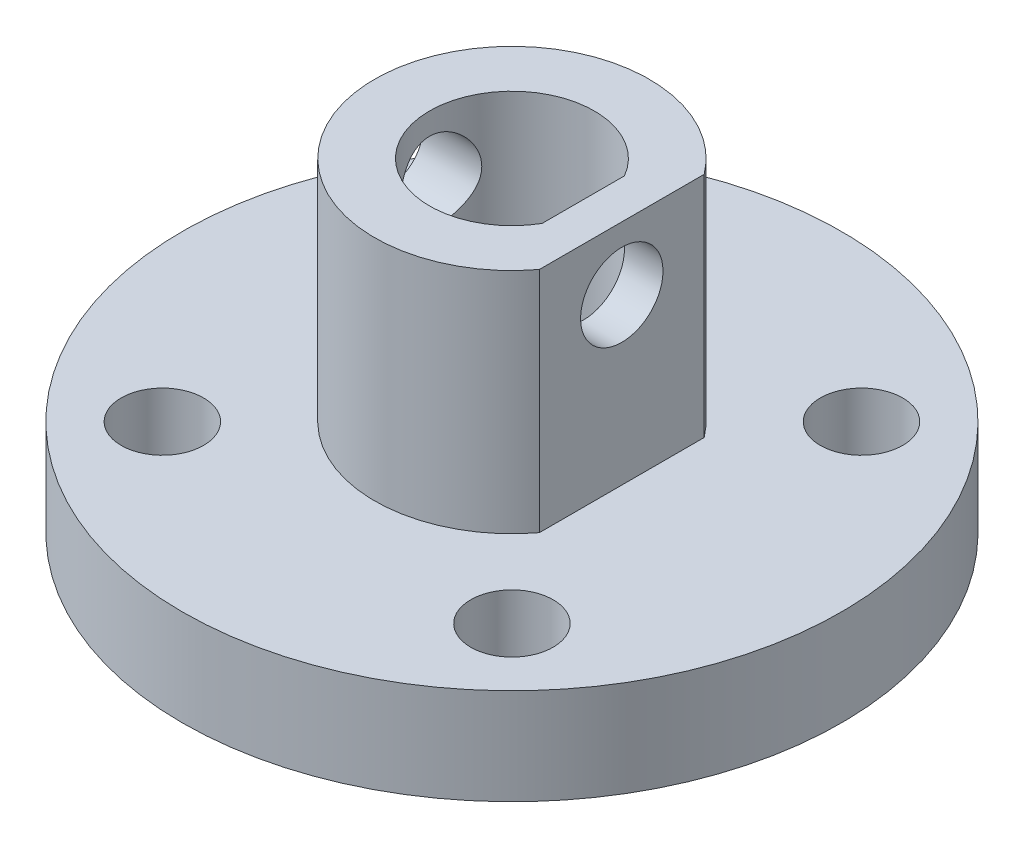
ISO-10303-21;
HEADER;
FILE_DESCRIPTION(('STEP AP214'),'2;1');
FILE_NAME('part.step','',(''),(''),'','','');
FILE_SCHEMA(('AUTOMOTIVE_DESIGN { 1 0 10303 214 1 1 1 1 }'));
ENDSEC;
DATA;
#1=APPLICATION_CONTEXT('core data for automotive mechanical design processes');
#2=APPLICATION_PROTOCOL_DEFINITION('international standard','automotive_design',2000,#1);
#3=PRODUCT_CONTEXT('',#1,'mechanical');
#4=PRODUCT('Part','Part','',(#3));
#5=PRODUCT_RELATED_PRODUCT_CATEGORY('part','',(#4));
#6=PRODUCT_DEFINITION_FORMATION('','',#4);
#7=PRODUCT_DEFINITION_CONTEXT('part definition',#1,'design');
#8=PRODUCT_DEFINITION('design','',#6,#7);
#9=PRODUCT_DEFINITION_SHAPE('','',#8);
#10=(LENGTH_UNIT() NAMED_UNIT(*) SI_UNIT(.MILLI.,.METRE.));
#11=(NAMED_UNIT(*) PLANE_ANGLE_UNIT() SI_UNIT($,.RADIAN.));
#12=(NAMED_UNIT(*) SI_UNIT($,.STERADIAN.) SOLID_ANGLE_UNIT());
#13=UNCERTAINTY_MEASURE_WITH_UNIT(LENGTH_MEASURE(1.E-05),#10,'distance_accuracy_value','');
#14=(GEOMETRIC_REPRESENTATION_CONTEXT(3) GLOBAL_UNCERTAINTY_ASSIGNED_CONTEXT((#13)) GLOBAL_UNIT_ASSIGNED_CONTEXT((#10,
#11,#12)) REPRESENTATION_CONTEXT('',''));
#15=CARTESIAN_POINT('',(0.,0.,0.));
#16=DIRECTION('',(0.,0.,1.));
#17=DIRECTION('',(1.,0.,0.));
#18=AXIS2_PLACEMENT_3D('',#15,#16,#17);
#19=CARTESIAN_POINT('',(2.59807621135332,3.5,0.));
#20=DIRECTION('',(1.,0.,0.));
#21=DIRECTION('',(0.,0.,-1.));
#22=AXIS2_PLACEMENT_3D('',#19,#20,#21);
#23=PLANE('',#22);
#24=DIRECTION('',(0.,-1.,0.));
#25=VECTOR('',#24,1.);
#26=CARTESIAN_POINT('',(2.59807621135332,3.5,-1.5));
#27=LINE('',#26,#25);
#28=CARTESIAN_POINT('',(2.59807621135332,11.8,-1.5));
#29=VERTEX_POINT('',#28);
#30=CARTESIAN_POINT('',(2.59807621135332,9.5,-1.5));
#31=VERTEX_POINT('',#30);
#32=EDGE_CURVE('E11',#29,#31,#27,.T.);
#33=ORIENTED_EDGE('',*,*,#32,.T.);
#34=CARTESIAN_POINT('',(2.59807621135332,9.5,0.));
#35=DIRECTION('',(1.,0.,0.));
#36=DIRECTION('',(0.,0.,-1.));
#37=AXIS2_PLACEMENT_3D('',#34,#35,#36);
#38=CIRCLE('',#37,1.5);
#39=CARTESIAN_POINT('',(2.59807621135332,9.5,1.5));
#40=VERTEX_POINT('',#39);
#41=EDGE_CURVE('E58',#31,#40,#38,.T.);
#42=ORIENTED_EDGE('',*,*,#41,.T.);
#43=DIRECTION('',(0.,-1.,0.));
#44=VECTOR('',#43,1.);
#45=CARTESIAN_POINT('',(2.59807621135332,3.5,1.5));
#46=LINE('',#45,#44);
#47=CARTESIAN_POINT('',(2.59807621135332,11.8,1.5));
#48=VERTEX_POINT('',#47);
#49=EDGE_CURVE('E97',#48,#40,#46,.T.);
#50=ORIENTED_EDGE('',*,*,#49,.F.);
#51=DIRECTION('',(0.,0.,1.));
#52=VECTOR('',#51,1.);
#53=CARTESIAN_POINT('',(2.59807621135332,11.8,0.));
#54=LINE('',#53,#52);
#55=EDGE_CURVE('E160',#29,#48,#54,.T.);
#56=ORIENTED_EDGE('',*,*,#55,.F.);
#57=EDGE_LOOP('',(#33,#42,#50,#56));
#58=FACE_BOUND('',#57,.T.);
#59=ADVANCED_FACE('F38',(#58),#23,.F.);
#60=CARTESIAN_POINT('',(0.,3.5,0.));
#61=DIRECTION('',(0.,1.,0.));
#62=DIRECTION('',(0.,0.,1.));
#63=AXIS2_PLACEMENT_3D('',#60,#61,#62);
#64=PLANE('',#63);
#65=CARTESIAN_POINT('',(0.,3.5,0.));
#66=DIRECTION('',(0.,1.,0.));
#67=DIRECTION('',(0.,0.,1.));
#68=AXIS2_PLACEMENT_3D('',#65,#66,#67);
#69=CIRCLE('',#68,12.);
#70=CARTESIAN_POINT('',(0.,3.5,12.));
#71=VERTEX_POINT('',#70);
#72=EDGE_CURVE('E108',#71,#71,#69,.T.);
#73=ORIENTED_EDGE('',*,*,#72,.T.);
#74=EDGE_LOOP('',(#73));
#75=FACE_BOUND('',#74,.T.);
#76=CARTESIAN_POINT('',(6.36396103067929,3.5,6.36396103067891));
#77=DIRECTION('',(0.,1.,0.));
#78=DIRECTION('',(0.,0.,1.));
#79=AXIS2_PLACEMENT_3D('',#76,#77,#78);
#80=CIRCLE('',#79,1.49999999999991);
#81=CARTESIAN_POINT('',(6.36396103067929,3.5,7.86396103067883));
#82=VERTEX_POINT('',#81);
#83=EDGE_CURVE('E137',#82,#82,#80,.T.);
#84=ORIENTED_EDGE('',*,*,#83,.F.);
#85=EDGE_LOOP('',(#84));
#86=FACE_BOUND('',#85,.T.);
#87=CARTESIAN_POINT('',(-6.36396103067856,3.5,6.36396103067929));
#88=DIRECTION('',(0.,1.,0.));
#89=DIRECTION('',(0.,0.,1.));
#90=AXIS2_PLACEMENT_3D('',#87,#88,#89);
#91=CIRCLE('',#90,1.50000000000027);
#92=CARTESIAN_POINT('',(-6.36396103067856,3.5,7.86396103067956));
#93=VERTEX_POINT('',#92);
#94=EDGE_CURVE('E140',#93,#93,#91,.T.);
#95=ORIENTED_EDGE('',*,*,#94,.F.);
#96=EDGE_LOOP('',(#95));
#97=FACE_BOUND('',#96,.T.);
#98=CARTESIAN_POINT('',(-6.36396103067894,3.5,-6.36396103067856));
#99=DIRECTION('',(0.,1.,0.));
#100=DIRECTION('',(0.,0.,1.));
#101=AXIS2_PLACEMENT_3D('',#98,#99,#100);
#102=CIRCLE('',#101,1.50000000000038);
#103=CARTESIAN_POINT('',(-6.36396103067894,3.5,-4.86396103067818));
#104=VERTEX_POINT('',#103);
#105=EDGE_CURVE('E143',#104,#104,#102,.T.);
#106=ORIENTED_EDGE('',*,*,#105,.F.);
#107=EDGE_LOOP('',(#106));
#108=FACE_BOUND('',#107,.T.);
#109=CARTESIAN_POINT('',(6.36396103067891,3.5,-6.36396103067894));
#110=DIRECTION('',(0.,1.,0.));
#111=DIRECTION('',(0.,0.,1.));
#112=AXIS2_PLACEMENT_3D('',#109,#110,#111);
#113=CIRCLE('',#112,1.5);
#114=CARTESIAN_POINT('',(6.36396103067891,3.5,-4.86396103067894));
#115=VERTEX_POINT('',#114);
#116=EDGE_CURVE('E118',#115,#115,#113,.T.);
#117=ORIENTED_EDGE('',*,*,#116,.F.);
#118=EDGE_LOOP('',(#117));
#119=FACE_BOUND('',#118,.T.);
#120=DIRECTION('',(0.,0.,1.));
#121=VECTOR('',#120,1.);
#122=CARTESIAN_POINT('',(4.,3.5,0.));
#123=LINE('',#122,#121);
#124=CARTESIAN_POINT('',(4.,3.5,-3.));
#125=VERTEX_POINT('',#124);
#126=CARTESIAN_POINT('',(4.,3.5,3.));
#127=VERTEX_POINT('',#126);
#128=EDGE_CURVE('E66',#125,#127,#123,.T.);
#129=ORIENTED_EDGE('',*,*,#128,.T.);
#130=CARTESIAN_POINT('',(0.,3.5,0.));
#131=DIRECTION('',(0.,1.,0.));
#132=DIRECTION('',(0.,0.,1.));
#133=AXIS2_PLACEMENT_3D('',#130,#131,#132);
#134=CIRCLE('',#133,5.);
#135=EDGE_CURVE('E152',#125,#127,#134,.T.);
#136=ORIENTED_EDGE('',*,*,#135,.F.);
#137=EDGE_LOOP('',(#129,#136));
#138=FACE_BOUND('',#137,.T.);
#139=ADVANCED_FACE('F189',(#75,#86,#97,#108,#119,#138),#64,.T.);
#140=CARTESIAN_POINT('',(0.,3.5,0.));
#141=DIRECTION('',(0.,-1.,0.));
#142=DIRECTION('',(0.,0.,-1.));
#143=AXIS2_PLACEMENT_3D('',#140,#141,#142);
#144=CYLINDRICAL_SURFACE('',#143,3.);
#145=CARTESIAN_POINT('',(-2.59807621135332,9.5,-1.5));
#146=CARTESIAN_POINT('',(-2.59808302092689,9.57816171229288,-1.4999945446118));
#147=CARTESIAN_POINT('',(-2.60165701781635,9.65642211728757,-1.49384995609983));
#148=CARTESIAN_POINT('',(-2.61543549678079,9.81054089701573,-1.46958481484708));
#149=CARTESIAN_POINT('',(-2.62565391083339,9.88639387256511,-1.45143909683127));
#150=CARTESIAN_POINT('',(-2.65124019908098,10.0331774965159,-1.40414992304972));
#151=CARTESIAN_POINT('',(-2.66658065209878,10.1041319787104,-1.3750649287406));
#152=CARTESIAN_POINT('',(-2.70063997225287,10.2401363029951,-1.30690128806456));
#153=CARTESIAN_POINT('',(-2.71935902214097,10.3051858253937,-1.26782210105366));
#154=CARTESIAN_POINT('',(-2.75995303586162,10.4334585928363,-1.17699981079632));
#155=CARTESIAN_POINT('',(-2.7819609545693,10.4960887035103,-1.12447805421566));
#156=CARTESIAN_POINT('',(-2.82557974178559,10.6121125826101,-1.0098807114217));
#157=CARTESIAN_POINT('',(-2.84719040746875,10.6655017438753,-0.94780038867344));
#158=CARTESIAN_POINT('',(-2.88932215429424,10.7650507267215,-0.81073434512182));
#159=CARTESIAN_POINT('',(-2.90967159627259,10.8104806517893,-0.735160783518863));
#160=CARTESIAN_POINT('',(-2.94526134149294,10.8877112798686,-0.576235539899257));
#161=CARTESIAN_POINT('',(-2.96050486775612,10.9195205842058,-0.492888807207234));
#162=CARTESIAN_POINT('',(-2.98320691866356,10.9662569919516,-0.327067415888967));
#163=CARTESIAN_POINT('',(-2.99114220331338,10.9822242895333,-0.244952685733227));
#164=CARTESIAN_POINT('',(-3.00011375769101,11.0002491780126,-0.0788559430467731));
#165=CARTESIAN_POINT('',(-3.00115420176885,11.0023151851936,0.00512490876560693));
#166=CARTESIAN_POINT('',(-2.99644472874675,10.9928799890445,0.164748786635624));
#167=CARTESIAN_POINT('',(-2.99127743838241,10.9825429767182,0.240481798765187));
#168=CARTESIAN_POINT('',(-2.97561367889621,10.950678734143,0.388970657877482));
#169=CARTESIAN_POINT('',(-2.96511681099591,10.9291506665357,0.461726281640888));
#170=CARTESIAN_POINT('',(-2.93957374931482,10.8753761508653,0.60346408735433));
#171=CARTESIAN_POINT('',(-2.92446662293799,10.8429855302419,0.672380135272767));
#172=CARTESIAN_POINT('',(-2.89106468980031,10.7686048756978,0.803965202269992));
#173=CARTESIAN_POINT('',(-2.87276874236226,10.7266114050465,0.866631973257968));
#174=CARTESIAN_POINT('',(-2.83266591598844,10.6296569727005,0.990260491347292));
#175=CARTESIAN_POINT('',(-2.81069063997263,10.573845457511,1.05050111254404));
#176=CARTESIAN_POINT('',(-2.76681510880218,10.4531154126047,1.16115655544667));
#177=CARTESIAN_POINT('',(-2.74491492398443,10.3881899415889,1.21156381736135));
#178=CARTESIAN_POINT('',(-2.70216234138727,10.2460277113639,1.30425800196332));
#179=CARTESIAN_POINT('',(-2.68146479986061,10.1682709654187,1.34582597246708));
#180=CARTESIAN_POINT('',(-2.64563175417864,10.0055934929615,1.41497866950185));
#181=CARTESIAN_POINT('',(-2.63049045069101,9.92068035047366,1.44257798731633));
#182=CARTESIAN_POINT('',(-2.60916953725552,9.75317823307581,1.48077031653756));
#183=CARTESIAN_POINT('',(-2.60237483772745,9.67093832143467,1.49253768317996));
#184=CARTESIAN_POINT('',(-2.59676879042414,9.50539798772519,1.50227541991714));
#185=CARTESIAN_POINT('',(-2.59795180333967,9.42209835632032,1.50025553597254));
#186=CARTESIAN_POINT('',(-2.60751504810877,9.26651912213191,1.48355406501595));
#187=CARTESIAN_POINT('',(-2.61509381259981,9.19403082333811,1.4702817250687));
#188=CARTESIAN_POINT('',(-2.63541032327012,9.05244832059356,1.43354442694866));
#189=CARTESIAN_POINT('',(-2.64814974007551,8.98335522388009,1.41007616793542));
#190=CARTESIAN_POINT('',(-2.67804333119485,8.84688300364596,1.35247138290733));
#191=CARTESIAN_POINT('',(-2.69537464864595,8.77973147471967,1.31789109553909));
#192=CARTESIAN_POINT('',(-2.73234179245875,8.65179609269151,1.23943059602371));
#193=CARTESIAN_POINT('',(-2.75197880032721,8.59101553473007,1.19554560649832));
#194=CARTESIAN_POINT('',(-2.79431997684504,8.46953184871468,1.09325575079828));
#195=CARTESIAN_POINT('',(-2.81709874731434,8.40980427392351,1.03371790847245));
#196=CARTESIAN_POINT('',(-2.86101352466839,8.30088164300961,0.905106743097434));
#197=CARTESIAN_POINT('',(-2.88214897511564,8.25169014465419,0.836030211983022));
#198=CARTESIAN_POINT('',(-2.92112042536435,8.16413941107485,0.687803043838137));
#199=CARTESIAN_POINT('',(-2.93885462508044,8.12610032268364,0.608434646361171));
#200=CARTESIAN_POINT('',(-2.96825032438951,8.06429314421391,0.443283546961625));
#201=CARTESIAN_POINT('',(-2.97991715514559,8.04051252295054,0.357506552088266));
#202=CARTESIAN_POINT('',(-2.99501262272824,8.00994715373801,0.190469523495627));
#203=CARTESIAN_POINT('',(-2.99909891862287,8.00180318618583,0.109517165775686));
#204=CARTESIAN_POINT('',(-3.00063195562697,7.9987351018184,-0.0526889789268048));
#205=CARTESIAN_POINT('',(-2.99808102100335,8.00380635721465,-0.13394265044263));
#206=CARTESIAN_POINT('',(-2.98700953256884,8.02612461019343,-0.28880698847572));
#207=CARTESIAN_POINT('',(-2.97889342001985,8.04254727388651,-0.362568476716895));
#208=CARTESIAN_POINT('',(-2.95788140495135,8.08599049895446,-0.506168928275426));
#209=CARTESIAN_POINT('',(-2.94498481699194,8.11301258014018,-0.576007327433263));
#210=CARTESIAN_POINT('',(-2.9148889612218,8.17809057824896,-0.713135109367327));
#211=CARTESIAN_POINT('',(-2.89752925798199,8.21656898481176,-0.780187714050069));
#212=CARTESIAN_POINT('',(-2.86032199712739,8.30293689628857,-0.907161962721037));
#213=CARTESIAN_POINT('',(-2.84047329837541,8.35083072367351,-0.96708031112236));
#214=CARTESIAN_POINT('',(-2.79792915339941,8.46019570853405,-1.08437100623534));
#215=CARTESIAN_POINT('',(-2.77514698517547,8.52254373121579,-1.14089652680891));
#216=CARTESIAN_POINT('',(-2.73094614244279,8.65617608169465,-1.24299493109201));
#217=CARTESIAN_POINT('',(-2.70952868642798,8.72746823130153,-1.28855812501509));
#218=CARTESIAN_POINT('',(-2.66999407957374,8.87995496987143,-1.36864661967848));
#219=CARTESIAN_POINT('',(-2.65200261384405,8.9613912966931,-1.40277759894141));
#220=CARTESIAN_POINT('',(-2.62299234492527,9.12999860650967,-1.45631806425962));
#221=CARTESIAN_POINT('',(-2.61195024221553,9.21714933336903,-1.47577678676302));
#222=CARTESIAN_POINT('',(-2.60293908902686,9.33770803347799,-1.49155051179662));
#223=CARTESIAN_POINT('',(-2.60112193507728,9.37005184159682,-1.49471415744578));
#224=CARTESIAN_POINT('',(-2.59868903831625,9.43492472102336,-1.49894010763494));
#225=CARTESIAN_POINT('',(-2.59807337587664,9.46745380457881,-1.50000227159981));
#226=CARTESIAN_POINT('',(-2.59807621135332,9.5,-1.5));
#227=B_SPLINE_CURVE_WITH_KNOTS('',3,(#145,#146,#147,#148,#149,#150,#151,#152,#153,#154,#155,
#156,#157,#158,#159,#160,#161,#162,#163,#164,#165,#166,#167,#168,#169,#170,#171,#172,#173,#174,
#175,#176,#177,#178,#179,#180,#181,#182,#183,#184,#185,#186,#187,#188,#189,#190,#191,#192,#193,
#194,#195,#196,#197,#198,#199,#200,#201,#202,#203,#204,#205,#206,#207,#208,#209,#210,#211,#212,
#213,#214,#215,#216,#217,#218,#219,#220,#221,#222,#223,#224,#225,#226),.UNSPECIFIED.,.T.,.F.,(4,
2,2,2,2,2,2,2,2,2,2,2,2,2,2,2,2,2,2,2,2,2,2,2,2,2,2,2,2,2,2,2,2,2,2,2,2,2,2,2,4),(0.,
0.234348183892073,0.469189339237207,0.702792893878325,0.936409088167724,1.18929346874735,
1.44230356626556,1.71236838358145,1.98226240445836,2.23295227451903,2.4834903552906,
2.71224146226807,2.94100968776183,3.1729430209672,3.40495949025408,3.65890787185336,
3.91305072368878,4.18333262594172,4.45333161317557,4.70193436281317,4.95036139782559,
5.17161275136038,5.39293578654094,5.62450944609131,5.85620229330071,6.1171011537092,
6.37808797467303,6.64596272119449,6.91360169713157,7.1566840558423,7.39968130190957,
7.62666637307239,7.8536840026802,8.09041126079208,8.32724745151079,8.58765362775101,
8.84828914267732,9.11716123557908,9.38512699504141,9.48270202777964,9.58028358741811),.UNSPECIFIED.);
#228=CARTESIAN_POINT('',(-2.59807621135332,9.5,-1.5));
#229=VERTEX_POINT('',#228);
#230=EDGE_CURVE('E99',#229,#229,#227,.T.);
#231=ORIENTED_EDGE('',*,*,#230,.F.);
#232=EDGE_LOOP('',(#231));
#233=FACE_BOUND('',#232,.T.);
#234=CARTESIAN_POINT('',(0.,0.,0.));
#235=DIRECTION('',(0.,1.,0.));
#236=DIRECTION('',(0.,0.,1.));
#237=AXIS2_PLACEMENT_3D('',#234,#235,#236);
#238=CIRCLE('',#237,3.);
#239=CARTESIAN_POINT('',(2.59807621135332,0.,-1.5));
#240=VERTEX_POINT('',#239);
#241=CARTESIAN_POINT('',(2.59807621135332,0.,1.5));
#242=VERTEX_POINT('',#241);
#243=EDGE_CURVE('E129',#240,#242,#238,.T.);
#244=ORIENTED_EDGE('',*,*,#243,.F.);
#245=EDGE_CURVE('E52',#31,#240,#27,.T.);
#246=ORIENTED_EDGE('',*,*,#245,.F.);
#247=ORIENTED_EDGE('',*,*,#32,.F.);
#248=CARTESIAN_POINT('',(0.,11.8,0.));
#249=DIRECTION('',(0.,1.,0.));
#250=DIRECTION('',(0.,0.,1.));
#251=AXIS2_PLACEMENT_3D('',#248,#249,#250);
#252=CIRCLE('',#251,3.);
#253=EDGE_CURVE('E113',#29,#48,#252,.T.);
#254=ORIENTED_EDGE('',*,*,#253,.T.);
#255=ORIENTED_EDGE('',*,*,#49,.T.);
#256=EDGE_CURVE('E101',#40,#242,#46,.T.);
#257=ORIENTED_EDGE('',*,*,#256,.T.);
#258=EDGE_LOOP('',(#244,#246,#247,#254,#255,#257));
#259=FACE_BOUND('',#258,.T.);
#260=ADVANCED_FACE('F111',(#233,#259),#144,.F.);
#261=CARTESIAN_POINT('',(6.36396103067929,3.5,6.36396103067891));
#262=DIRECTION('',(0.,-1.,0.));
#263=DIRECTION('',(0.,0.,-1.));
#264=AXIS2_PLACEMENT_3D('',#261,#262,#263);
#265=CYLINDRICAL_SURFACE('',#264,1.49999999999991);
#266=ORIENTED_EDGE('',*,*,#83,.T.);
#267=EDGE_LOOP('',(#266));
#268=FACE_BOUND('',#267,.T.);
#269=CARTESIAN_POINT('',(6.36396103067929,0.,6.36396103067891));
#270=DIRECTION('',(0.,1.,0.));
#271=DIRECTION('',(0.,0.,1.));
#272=AXIS2_PLACEMENT_3D('',#269,#270,#271);
#273=CIRCLE('',#272,1.49999999999991);
#274=CARTESIAN_POINT('',(6.36396103067929,0.,7.86396103067883));
#275=VERTEX_POINT('',#274);
#276=EDGE_CURVE('E119',#275,#275,#273,.T.);
#277=ORIENTED_EDGE('',*,*,#276,.F.);
#278=EDGE_LOOP('',(#277));
#279=FACE_BOUND('',#278,.T.);
#280=ADVANCED_FACE('F200',(#268,#279),#265,.F.);
#281=CARTESIAN_POINT('',(-6.36396103067856,3.5,6.36396103067929));
#282=DIRECTION('',(0.,-1.,0.));
#283=DIRECTION('',(0.,0.,-1.));
#284=AXIS2_PLACEMENT_3D('',#281,#282,#283);
#285=CYLINDRICAL_SURFACE('',#284,1.50000000000027);
#286=ORIENTED_EDGE('',*,*,#94,.T.);
#287=EDGE_LOOP('',(#286));
#288=FACE_BOUND('',#287,.T.);
#289=CARTESIAN_POINT('',(-6.36396103067856,0.,6.36396103067929));
#290=DIRECTION('',(0.,1.,0.));
#291=DIRECTION('',(0.,0.,1.));
#292=AXIS2_PLACEMENT_3D('',#289,#290,#291);
#293=CIRCLE('',#292,1.50000000000027);
#294=CARTESIAN_POINT('',(-6.36396103067856,0.,7.86396103067956));
#295=VERTEX_POINT('',#294);
#296=EDGE_CURVE('E122',#295,#295,#293,.T.);
#297=ORIENTED_EDGE('',*,*,#296,.F.);
#298=EDGE_LOOP('',(#297));
#299=FACE_BOUND('',#298,.T.);
#300=ADVANCED_FACE('F203',(#288,#299),#285,.F.);
#301=CARTESIAN_POINT('',(-6.36396103067894,3.5,-6.36396103067856));
#302=DIRECTION('',(0.,-1.,0.));
#303=DIRECTION('',(0.,0.,-1.));
#304=AXIS2_PLACEMENT_3D('',#301,#302,#303);
#305=CYLINDRICAL_SURFACE('',#304,1.50000000000038);
#306=ORIENTED_EDGE('',*,*,#105,.T.);
#307=EDGE_LOOP('',(#306));
#308=FACE_BOUND('',#307,.T.);
#309=CARTESIAN_POINT('',(-6.36396103067894,0.,-6.36396103067856));
#310=DIRECTION('',(0.,1.,0.));
#311=DIRECTION('',(0.,0.,1.));
#312=AXIS2_PLACEMENT_3D('',#309,#310,#311);
#313=CIRCLE('',#312,1.50000000000038);
#314=CARTESIAN_POINT('',(-6.36396103067894,0.,-4.86396103067818));
#315=VERTEX_POINT('',#314);
#316=EDGE_CURVE('E125',#315,#315,#313,.T.);
#317=ORIENTED_EDGE('',*,*,#316,.F.);
#318=EDGE_LOOP('',(#317));
#319=FACE_BOUND('',#318,.T.);
#320=ADVANCED_FACE('F207',(#308,#319),#305,.F.);
#321=ORIENTED_EDGE('',*,*,#256,.F.);
#322=EDGE_CURVE('E88',#40,#31,#38,.T.);
#323=ORIENTED_EDGE('',*,*,#322,.T.);
#324=ORIENTED_EDGE('',*,*,#245,.T.);
#325=DIRECTION('',(0.,0.,1.));
#326=VECTOR('',#325,1.);
#327=CARTESIAN_POINT('',(2.59807621135332,0.,0.));
#328=LINE('',#327,#326);
#329=EDGE_CURVE('E104',#240,#242,#328,.T.);
#330=ORIENTED_EDGE('',*,*,#329,.T.);
#331=EDGE_LOOP('',(#321,#323,#324,#330));
#332=FACE_BOUND('',#331,.T.);
#333=ADVANCED_FACE('F102',(#332),#23,.F.);
#334=CARTESIAN_POINT('',(6.36396103067891,3.5,-6.36396103067894));
#335=DIRECTION('',(0.,-1.,0.));
#336=DIRECTION('',(0.,0.,-1.));
#337=AXIS2_PLACEMENT_3D('',#334,#335,#336);
#338=CYLINDRICAL_SURFACE('',#337,1.5);
#339=ORIENTED_EDGE('',*,*,#116,.T.);
#340=EDGE_LOOP('',(#339));
#341=FACE_BOUND('',#340,.T.);
#342=CARTESIAN_POINT('',(6.36396103067891,0.,-6.36396103067894));
#343=DIRECTION('',(0.,1.,0.));
#344=DIRECTION('',(0.,0.,1.));
#345=AXIS2_PLACEMENT_3D('',#342,#343,#344);
#346=CIRCLE('',#345,1.5);
#347=CARTESIAN_POINT('',(6.36396103067891,0.,-4.86396103067894));
#348=VERTEX_POINT('',#347);
#349=EDGE_CURVE('E131',#348,#348,#346,.T.);
#350=ORIENTED_EDGE('',*,*,#349,.F.);
#351=EDGE_LOOP('',(#350));
#352=FACE_BOUND('',#351,.T.);
#353=ADVANCED_FACE('F40',(#341,#352),#338,.F.);
#354=CARTESIAN_POINT('',(0.,3.5,0.));
#355=DIRECTION('',(0.,-1.,0.));
#356=DIRECTION('',(0.,0.,-1.));
#357=AXIS2_PLACEMENT_3D('',#354,#355,#356);
#358=CYLINDRICAL_SURFACE('',#357,12.);
#359=ORIENTED_EDGE('',*,*,#72,.F.);
#360=EDGE_LOOP('',(#359));
#361=FACE_BOUND('',#360,.T.);
#362=CARTESIAN_POINT('',(0.,0.,0.));
#363=DIRECTION('',(0.,1.,0.));
#364=DIRECTION('',(0.,0.,1.));
#365=AXIS2_PLACEMENT_3D('',#362,#363,#364);
#366=CIRCLE('',#365,12.);
#367=CARTESIAN_POINT('',(0.,0.,12.));
#368=VERTEX_POINT('',#367);
#369=EDGE_CURVE('E115',#368,#368,#366,.T.);
#370=ORIENTED_EDGE('',*,*,#369,.T.);
#371=EDGE_LOOP('',(#370));
#372=FACE_BOUND('',#371,.T.);
#373=ADVANCED_FACE('F195',(#361,#372),#358,.T.);
#374=CARTESIAN_POINT('',(0.,0.,0.));
#375=DIRECTION('',(0.,1.,0.));
#376=DIRECTION('',(0.,0.,1.));
#377=AXIS2_PLACEMENT_3D('',#374,#375,#376);
#378=PLANE('',#377);
#379=ORIENTED_EDGE('',*,*,#349,.T.);
#380=EDGE_LOOP('',(#379));
#381=FACE_BOUND('',#380,.T.);
#382=ORIENTED_EDGE('',*,*,#243,.T.);
#383=ORIENTED_EDGE('',*,*,#329,.F.);
#384=EDGE_LOOP('',(#382,#383));
#385=FACE_BOUND('',#384,.T.);
#386=ORIENTED_EDGE('',*,*,#316,.T.);
#387=EDGE_LOOP('',(#386));
#388=FACE_BOUND('',#387,.T.);
#389=ORIENTED_EDGE('',*,*,#296,.T.);
#390=EDGE_LOOP('',(#389));
#391=FACE_BOUND('',#390,.T.);
#392=ORIENTED_EDGE('',*,*,#276,.T.);
#393=EDGE_LOOP('',(#392));
#394=FACE_BOUND('',#393,.T.);
#395=ORIENTED_EDGE('',*,*,#369,.F.);
#396=EDGE_LOOP('',(#395));
#397=FACE_BOUND('',#396,.T.);
#398=ADVANCED_FACE('F187',(#381,#385,#388,#391,#394,#397),#378,.F.);
#399=CARTESIAN_POINT('',(4.,11.8,0.));
#400=DIRECTION('',(1.,0.,0.));
#401=DIRECTION('',(0.,0.,-1.));
#402=AXIS2_PLACEMENT_3D('',#399,#400,#401);
#403=PLANE('',#402);
#404=CARTESIAN_POINT('',(4.,9.5,0.));
#405=DIRECTION('',(1.,0.,0.));
#406=DIRECTION('',(0.,0.,-1.));
#407=AXIS2_PLACEMENT_3D('',#404,#405,#406);
#408=CIRCLE('',#407,1.5);
#409=CARTESIAN_POINT('',(4.,9.5,-1.5));
#410=VERTEX_POINT('',#409);
#411=EDGE_CURVE('E338',#410,#410,#408,.T.);
#412=ORIENTED_EDGE('',*,*,#411,.F.);
#413=EDGE_LOOP('',(#412));
#414=FACE_BOUND('',#413,.T.);
#415=ORIENTED_EDGE('',*,*,#128,.F.);
#416=DIRECTION('',(0.,-1.,0.));
#417=VECTOR('',#416,1.);
#418=CARTESIAN_POINT('',(4.,11.8,-3.));
#419=LINE('',#418,#417);
#420=CARTESIAN_POINT('',(4.,11.8,-3.));
#421=VERTEX_POINT('',#420);
#422=EDGE_CURVE('E134',#421,#125,#419,.T.);
#423=ORIENTED_EDGE('',*,*,#422,.F.);
#424=DIRECTION('',(0.,0.,1.));
#425=VECTOR('',#424,1.);
#426=CARTESIAN_POINT('',(4.,11.8,0.));
#427=LINE('',#426,#425);
#428=CARTESIAN_POINT('',(4.,11.8,3.));
#429=VERTEX_POINT('',#428);
#430=EDGE_CURVE('E157',#421,#429,#427,.T.);
#431=ORIENTED_EDGE('',*,*,#430,.T.);
#432=DIRECTION('',(0.,-1.,0.));
#433=VECTOR('',#432,1.);
#434=CARTESIAN_POINT('',(4.,11.8,3.));
#435=LINE('',#434,#433);
#436=EDGE_CURVE('E149',#429,#127,#435,.T.);
#437=ORIENTED_EDGE('',*,*,#436,.T.);
#438=EDGE_LOOP('',(#415,#423,#431,#437));
#439=FACE_BOUND('',#438,.T.);
#440=ADVANCED_FACE('F183',(#414,#439),#403,.T.);
#441=CARTESIAN_POINT('',(0.,11.8,0.));
#442=DIRECTION('',(0.,-1.,0.));
#443=DIRECTION('',(0.,0.,-1.));
#444=AXIS2_PLACEMENT_3D('',#441,#442,#443);
#445=CYLINDRICAL_SURFACE('',#444,5.);
#446=CARTESIAN_POINT('',(-4.76969600708473,9.5,-1.5));
#447=CARTESIAN_POINT('',(-4.7696968572698,9.5821945479424,-1.49999897633764));
#448=CARTESIAN_POINT('',(-4.77184390209069,9.66439922414402,-1.49322108167142));
#449=CARTESIAN_POINT('',(-4.780165783029,9.82640524959194,-1.46635844446749));
#450=CARTESIAN_POINT('',(-4.78634196493468,9.90620578650146,-1.44626925573578));
#451=CARTESIAN_POINT('',(-4.80196102485632,10.0610347282717,-1.39352753269955));
#452=CARTESIAN_POINT('',(-4.81139846703232,10.1360708296331,-1.36089589394243));
#453=CARTESIAN_POINT('',(-4.83246932547567,10.2796219339953,-1.28406421917929));
#454=CARTESIAN_POINT('',(-4.84410307041019,10.3481359586844,-1.23986245137053));
#455=CARTESIAN_POINT('',(-4.86866862185765,10.4788663905774,-1.13964754141627));
#456=CARTESIAN_POINT('',(-4.88162808311636,10.5408458979463,-1.08333207175807));
#457=CARTESIAN_POINT('',(-4.90714861936757,10.6546379513225,-0.9611362375796));
#458=CARTESIAN_POINT('',(-4.91970964297705,10.7064491904499,-0.895254645461112));
#459=CARTESIAN_POINT('',(-4.94333214579389,10.7994626998333,-0.754111437793691));
#460=CARTESIAN_POINT('',(-4.95435724342404,10.8404234244428,-0.678684021335815));
#461=CARTESIAN_POINT('',(-4.97334435920684,10.9089872590428,-0.521624645369355));
#462=CARTESIAN_POINT('',(-4.98130703789495,10.9365932498574,-0.439994028387912));
#463=CARTESIAN_POINT('',(-4.99307646003589,10.9768800010905,-0.27532385263083));
#464=CARTESIAN_POINT('',(-4.99699557369338,10.9899651276527,-0.192391398953802));
#465=CARTESIAN_POINT('',(-5.00063201501348,11.0021173246464,-0.0254218237493162));
#466=CARTESIAN_POINT('',(-5.00035022521079,11.001187339402,0.058615062050367));
#467=CARTESIAN_POINT('',(-4.99569603817659,10.985607131457,0.222571156600159));
#468=CARTESIAN_POINT('',(-4.9914542020526,10.9713948061901,0.30253626764134));
#469=CARTESIAN_POINT('',(-4.97951522112593,10.9303686640057,0.458889213442525));
#470=CARTESIAN_POINT('',(-4.97181785750586,10.9035540490573,0.535276821322844));
#471=CARTESIAN_POINT('',(-4.95365220986963,10.8377879765814,0.68334732635128));
#472=CARTESIAN_POINT('',(-4.94315269676706,10.7986987971927,0.754965064694477));
#473=CARTESIAN_POINT('',(-4.92049640648069,10.7096021475718,0.890764673783155));
#474=CARTESIAN_POINT('',(-4.90833923637778,10.6595920870365,0.954944774872129));
#475=CARTESIAN_POINT('',(-4.88311550488166,10.5478022492484,1.0766604815298));
#476=CARTESIAN_POINT('',(-4.87003195321461,10.4856430809703,1.13384458040111));
#477=CARTESIAN_POINT('',(-4.84483979887497,10.35248998211,1.23707651539823));
#478=CARTESIAN_POINT('',(-4.8327312931702,10.2814951746108,1.28312324482852));
#479=CARTESIAN_POINT('',(-4.81077903197678,10.131760530751,1.3631399533545));
#480=CARTESIAN_POINT('',(-4.80095810695957,10.0529529541371,1.39698989237679));
#481=CARTESIAN_POINT('',(-4.78496392548436,9.89039279155446,1.45083362878413));
#482=CARTESIAN_POINT('',(-4.7787894791583,9.80664182846544,1.4708319464056));
#483=CARTESIAN_POINT('',(-4.77104849541241,9.63991763926072,1.49574770282165));
#484=CARTESIAN_POINT('',(-4.76931878670441,9.55703177610602,1.50119946380212));
#485=CARTESIAN_POINT('',(-4.77021192441924,9.39152709999013,1.49835947233062));
#486=CARTESIAN_POINT('',(-4.77283416156589,9.30890825126915,1.4900696437133));
#487=CARTESIAN_POINT('',(-4.78197558554912,9.14851162202913,1.4604576357419));
#488=CARTESIAN_POINT('',(-4.78839176507489,9.07066383573648,1.4394796143128));
#489=CARTESIAN_POINT('',(-4.80429141231227,8.91959830918509,1.3854857774794));
#490=CARTESIAN_POINT('',(-4.81377535359073,8.84638128585943,1.3524681034276));
#491=CARTESIAN_POINT('',(-4.83505835023047,8.70448253592787,1.274318711965));
#492=CARTESIAN_POINT('',(-4.84691271069798,8.63597527901421,1.22888564172729));
#493=CARTESIAN_POINT('',(-4.87148205646987,8.5073618938192,1.12755301600385));
#494=CARTESIAN_POINT('',(-4.88419724730003,8.44725778238721,1.07165095534897));
#495=CARTESIAN_POINT('',(-4.90963633548158,8.33481959418526,0.948455132493599));
#496=CARTESIAN_POINT('',(-4.92234245063004,8.28286437101302,0.880811065857435));
#497=CARTESIAN_POINT('',(-4.94584851748651,8.19103329897225,0.73746178459025));
#498=CARTESIAN_POINT('',(-4.95664856384717,8.15115685021854,0.661756970543946));
#499=CARTESIAN_POINT('',(-4.97505970474957,8.08499996943171,0.504935504705223));
#500=CARTESIAN_POINT('',(-4.98269453424966,8.05861798384102,0.423864622037841));
#501=CARTESIAN_POINT('',(-4.99401979596827,8.01993908110958,0.25816996650459));
#502=CARTESIAN_POINT('',(-4.9977113567088,8.00763813405158,0.173547217354764));
#503=CARTESIAN_POINT('',(-5.00066544081399,7.9977769559455,0.00665215388274452));
#504=CARTESIAN_POINT('',(-5.00009305111322,7.99966730459217,-0.0755851790862049));
#505=CARTESIAN_POINT('',(-4.99497264465037,8.01682163249912,-0.238519481164402));
#506=CARTESIAN_POINT('',(-4.99042485330462,8.03208485348044,-0.319216537346527));
#507=CARTESIAN_POINT('',(-4.97791168358327,8.07521166139962,-0.475935813041356));
#508=CARTESIAN_POINT('',(-4.96998352900866,8.10293818064901,-0.55199892735139));
#509=CARTESIAN_POINT('',(-4.9515294303945,8.17008191450719,-0.698433237752051));
#510=CARTESIAN_POINT('',(-4.94100305949946,8.20950105028619,-0.768803496050578));
#511=CARTESIAN_POINT('',(-4.91803965828228,8.30037345743003,-0.904301892420562));
#512=CARTESIAN_POINT('',(-4.90555226923559,8.35217143000077,-0.969190250076766));
#513=CARTESIAN_POINT('',(-4.88023537212334,8.4657103883328,-1.08953757134594));
#514=CARTESIAN_POINT('',(-4.86740576641079,8.52745423789815,-1.14499380960193));
#515=CARTESIAN_POINT('',(-4.84240680631319,8.6613407783105,-1.24656269394549));
#516=CARTESIAN_POINT('',(-4.83026852693485,8.73373855339043,-1.29234759757956));
#517=CARTESIAN_POINT('',(-4.80852547508793,8.88555517416102,-1.37104313528776));
#518=CARTESIAN_POINT('',(-4.79891948596955,8.96497062360119,-1.40395995557288));
#519=CARTESIAN_POINT('',(-4.78427816717595,9.11974043160627,-1.45301942532949));
#520=CARTESIAN_POINT('',(-4.7788615484052,9.19460864693099,-1.47058859011232));
#521=CARTESIAN_POINT('',(-4.77157042597167,9.34631522249577,-1.49407818835144));
#522=CARTESIAN_POINT('',(-4.7696952122143,9.42315318464525,-1.50000095706095));
#523=CARTESIAN_POINT('',(-4.76969600708473,9.5,-1.5));
#524=B_SPLINE_CURVE_WITH_KNOTS('',3,(#446,#447,#448,#449,#450,#451,#452,#453,#454,#455,#456,
#457,#458,#459,#460,#461,#462,#463,#464,#465,#466,#467,#468,#469,#470,#471,#472,#473,#474,#475,
#476,#477,#478,#479,#480,#481,#482,#483,#484,#485,#486,#487,#488,#489,#490,#491,#492,#493,#494,
#495,#496,#497,#498,#499,#500,#501,#502,#503,#504,#505,#506,#507,#508,#509,#510,#511,#512,#513,
#514,#515,#516,#517,#518,#519,#520,#521,#522,#523),.UNSPECIFIED.,.T.,.F.,(4,2,2,2,2,2,2,2,2,2,2,
2,2,2,2,2,2,2,2,2,2,2,2,2,2,2,2,2,2,2,2,2,2,2,2,2,2,2,4),(0.,0.246300165915542,
0.492682641688999,0.738656414466193,0.9846670253701,1.23773150007984,1.49082847871273,
1.74915939273644,2.00743455587877,2.25832140149558,2.5091555410144,2.7520012599088,
2.99486235890376,3.24055209335676,3.4863001659083,3.74152147023278,3.99676812491863,
4.25446238246266,4.51207250628411,4.76008080790309,5.00805439107388,5.24958594938817,
5.49115481045787,5.73920731809388,5.98731925928923,6.24479506100602,6.50225807324202,
6.75775391814325,7.01317662321682,7.2587630391122,7.50433553047754,7.74727096872219,
7.99024634491378,8.24099627054488,8.4918185262989,8.75011639669147,9.00828993963944,
9.23861153857448,9.4688869503356),.UNSPECIFIED.);
#525=CARTESIAN_POINT('',(-4.76969600708473,9.5,-1.5));
#526=VERTEX_POINT('',#525);
#527=EDGE_CURVE('E42',#526,#526,#524,.T.);
#528=ORIENTED_EDGE('',*,*,#527,.T.);
#529=EDGE_LOOP('',(#528));
#530=FACE_BOUND('',#529,.T.);
#531=ORIENTED_EDGE('',*,*,#135,.T.);
#532=ORIENTED_EDGE('',*,*,#436,.F.);
#533=CARTESIAN_POINT('',(0.,11.8,0.));
#534=DIRECTION('',(0.,1.,0.));
#535=DIRECTION('',(0.,0.,1.));
#536=AXIS2_PLACEMENT_3D('',#533,#534,#535);
#537=CIRCLE('',#536,5.);
#538=EDGE_CURVE('E151',#421,#429,#537,.T.);
#539=ORIENTED_EDGE('',*,*,#538,.F.);
#540=ORIENTED_EDGE('',*,*,#422,.T.);
#541=EDGE_LOOP('',(#531,#532,#539,#540));
#542=FACE_BOUND('',#541,.T.);
#543=ADVANCED_FACE('F178',(#530,#542),#445,.T.);
#544=CARTESIAN_POINT('',(0.,11.8,0.));
#545=DIRECTION('',(0.,1.,0.));
#546=DIRECTION('',(0.,0.,1.));
#547=AXIS2_PLACEMENT_3D('',#544,#545,#546);
#548=PLANE('',#547);
#549=ORIENTED_EDGE('',*,*,#253,.F.);
#550=ORIENTED_EDGE('',*,*,#55,.T.);
#551=EDGE_LOOP('',(#549,#550));
#552=FACE_BOUND('',#551,.T.);
#553=ORIENTED_EDGE('',*,*,#430,.F.);
#554=ORIENTED_EDGE('',*,*,#538,.T.);
#555=EDGE_LOOP('',(#553,#554));
#556=FACE_BOUND('',#555,.T.);
#557=ADVANCED_FACE('F175',(#552,#556),#548,.T.);
#558=CARTESIAN_POINT('',(-15.,9.5,0.));
#559=DIRECTION('',(1.,0.,0.));
#560=DIRECTION('',(0.,0.,-1.));
#561=AXIS2_PLACEMENT_3D('',#558,#559,#560);
#562=CYLINDRICAL_SURFACE('',#561,1.5);
#563=ORIENTED_EDGE('',*,*,#230,.T.);
#564=EDGE_LOOP('',(#563));
#565=FACE_BOUND('',#564,.T.);
#566=ORIENTED_EDGE('',*,*,#527,.F.);
#567=EDGE_LOOP('',(#566));
#568=FACE_BOUND('',#567,.T.);
#569=ADVANCED_FACE('F173',(#565,#568),#562,.F.);
#570=ORIENTED_EDGE('',*,*,#411,.T.);
#571=EDGE_LOOP('',(#570));
#572=FACE_BOUND('',#571,.T.);
#573=ORIENTED_EDGE('',*,*,#322,.F.);
#574=ORIENTED_EDGE('',*,*,#41,.F.);
#575=EDGE_LOOP('',(#573,#574));
#576=FACE_BOUND('',#575,.T.);
#577=ADVANCED_FACE('F89',(#572,#576),#562,.F.);
#578=CLOSED_SHELL('',(#59,#139,#260,#280,#300,#320,#333,#353,#373,#398,#440,#543,#557,#569,#577));
#579=MANIFOLD_SOLID_BREP('B2',#578);
#580=ADVANCED_BREP_SHAPE_REPRESENTATION('',(#18,#579),#14);
#581=SHAPE_DEFINITION_REPRESENTATION(#9,#580);
ENDSEC;
END-ISO-10303-21;
